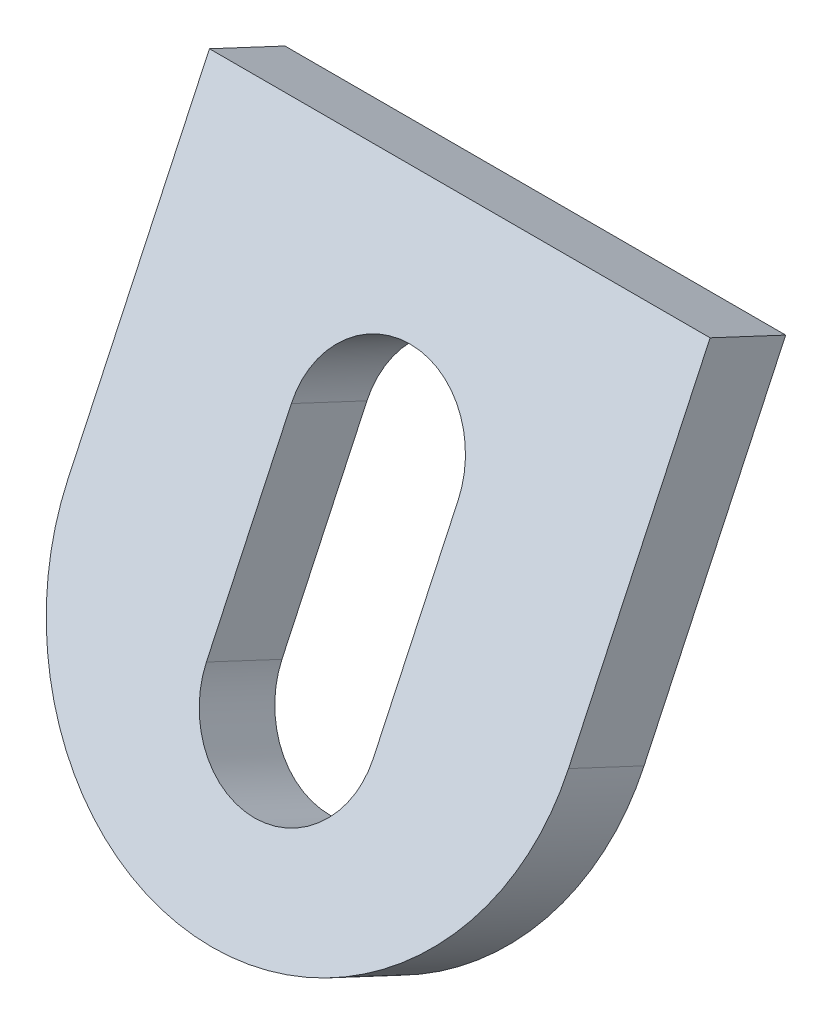
ISO-10303-21;
HEADER;
FILE_DESCRIPTION(('STEP AP214'),'2;1');
FILE_NAME('part.step','',(''),(''),'','','');
FILE_SCHEMA(('AUTOMOTIVE_DESIGN { 1 0 10303 214 1 1 1 1 }'));
ENDSEC;
DATA;
#1=APPLICATION_CONTEXT('core data for automotive mechanical design processes');
#2=APPLICATION_PROTOCOL_DEFINITION('international standard','automotive_design',2000,#1);
#3=PRODUCT_CONTEXT('',#1,'mechanical');
#4=PRODUCT('Part','Part','',(#3));
#5=PRODUCT_RELATED_PRODUCT_CATEGORY('part','',(#4));
#6=PRODUCT_DEFINITION_FORMATION('','',#4);
#7=PRODUCT_DEFINITION_CONTEXT('part definition',#1,'design');
#8=PRODUCT_DEFINITION('design','',#6,#7);
#9=PRODUCT_DEFINITION_SHAPE('','',#8);
#10=(LENGTH_UNIT() NAMED_UNIT(*) SI_UNIT(.MILLI.,.METRE.));
#11=(NAMED_UNIT(*) PLANE_ANGLE_UNIT() SI_UNIT($,.RADIAN.));
#12=(NAMED_UNIT(*) SI_UNIT($,.STERADIAN.) SOLID_ANGLE_UNIT());
#13=UNCERTAINTY_MEASURE_WITH_UNIT(LENGTH_MEASURE(1.E-05),#10,'distance_accuracy_value','');
#14=(GEOMETRIC_REPRESENTATION_CONTEXT(3) GLOBAL_UNCERTAINTY_ASSIGNED_CONTEXT((#13)) GLOBAL_UNIT_ASSIGNED_CONTEXT((#10,
#11,#12)) REPRESENTATION_CONTEXT('',''));
#15=CARTESIAN_POINT('',(0.,0.,0.));
#16=DIRECTION('',(0.,0.,1.));
#17=DIRECTION('',(1.,0.,0.));
#18=AXIS2_PLACEMENT_3D('',#15,#16,#17);
#19=CARTESIAN_POINT('',(-213.964586571095,410.146358388483,-126.048610694878));
#20=DIRECTION('',(0.,0.424263950718159,0.905538569096325));
#21=DIRECTION('',(0.,-0.905538569096325,0.424263950718159));
#22=AXIS2_PLACEMENT_3D('',#19,#20,#21);
#23=PLANE('',#22);
#24=DIRECTION('',(0.,-0.905538569096325,0.424263950718158));
#25=VECTOR('',#24,1.);
#26=CARTESIAN_POINT('',(-223.489586571095,421.646698216007,-131.436762868998));
#27=LINE('',#26,#25);
#28=CARTESIAN_POINT('',(-223.489586571095,421.646698216007,-131.436762868998));
#29=VERTEX_POINT('',#28);
#30=CARTESIAN_POINT('',(-223.489586571095,410.146358388483,-126.048610694878));
#31=VERTEX_POINT('',#30);
#32=EDGE_CURVE('E140',#29,#31,#27,.T.);
#33=ORIENTED_EDGE('',*,*,#32,.T.);
#34=CARTESIAN_POINT('',(-213.964586571095,410.146358388483,-126.048610694878));
#35=DIRECTION('',(0.,0.424263950718159,0.905538569096325));
#36=DIRECTION('',(0.,-0.905538569096325,0.424263950718159));
#37=AXIS2_PLACEMENT_3D('',#34,#35,#36);
#38=CIRCLE('',#37,9.52500000000003);
#39=CARTESIAN_POINT('',(-204.439586571095,410.146358388483,-126.048610694878));
#40=VERTEX_POINT('',#39);
#41=EDGE_CURVE('E143',#31,#40,#38,.T.);
#42=ORIENTED_EDGE('',*,*,#41,.T.);
#43=DIRECTION('',(0.,0.905538569096325,-0.424263950718158));
#44=VECTOR('',#43,1.);
#45=CARTESIAN_POINT('',(-204.439586571095,421.646698216007,-131.436762868998));
#46=LINE('',#45,#44);
#47=CARTESIAN_POINT('',(-204.439586571095,421.646698216007,-131.436762868998));
#48=VERTEX_POINT('',#47);
#49=EDGE_CURVE('E146',#40,#48,#46,.T.);
#50=ORIENTED_EDGE('',*,*,#49,.T.);
#51=DIRECTION('',(-1.,0.,0.));
#52=VECTOR('',#51,1.);
#53=CARTESIAN_POINT('',(-223.489586571095,421.646698216007,-131.436762868998));
#54=LINE('',#53,#52);
#55=EDGE_CURVE('E148',#48,#29,#54,.T.);
#56=ORIENTED_EDGE('',*,*,#55,.T.);
#57=EDGE_LOOP('',(#33,#42,#50,#56));
#58=FACE_BOUND('',#57,.T.);
#59=DIRECTION('',(0.,-0.905538569096325,0.424263950718158));
#60=VECTOR('',#59,1.);
#61=CARTESIAN_POINT('',(-217.139586571095,414.746494319493,-128.203871564526));
#62=LINE('',#61,#60);
#63=CARTESIAN_POINT('',(-217.139586571095,414.746494319493,-128.203871564526));
#64=VERTEX_POINT('',#63);
#65=CARTESIAN_POINT('',(-217.139586571095,407.846290422979,-124.970980260054));
#66=VERTEX_POINT('',#65);
#67=EDGE_CURVE('E112',#64,#66,#62,.T.);
#68=ORIENTED_EDGE('',*,*,#67,.F.);
#69=CARTESIAN_POINT('',(-213.964586571095,414.746494319493,-128.203871564526));
#70=DIRECTION('',(0.,0.424263950718159,0.905538569096325));
#71=DIRECTION('',(0.,-0.905538569096325,0.424263950718159));
#72=AXIS2_PLACEMENT_3D('',#69,#70,#71);
#73=CIRCLE('',#72,3.17500000000001);
#74=CARTESIAN_POINT('',(-210.789586571095,414.746494319493,-128.203871564526));
#75=VERTEX_POINT('',#74);
#76=EDGE_CURVE('E104',#75,#64,#73,.T.);
#77=ORIENTED_EDGE('',*,*,#76,.F.);
#78=DIRECTION('',(0.,0.905538569096325,-0.424263950718158));
#79=VECTOR('',#78,1.);
#80=CARTESIAN_POINT('',(-210.789586571095,407.846290422979,-124.970980260054));
#81=LINE('',#80,#79);
#82=CARTESIAN_POINT('',(-210.789586571095,407.846290422979,-124.970980260054));
#83=VERTEX_POINT('',#82);
#84=EDGE_CURVE('E126',#83,#75,#81,.T.);
#85=ORIENTED_EDGE('',*,*,#84,.F.);
#86=CARTESIAN_POINT('',(-213.964586571095,407.846290422979,-124.970980260054));
#87=DIRECTION('',(0.,0.424263950718159,0.905538569096325));
#88=DIRECTION('',(0.,-0.905538569096325,0.424263950718159));
#89=AXIS2_PLACEMENT_3D('',#86,#87,#88);
#90=CIRCLE('',#89,3.17500000000001);
#91=EDGE_CURVE('E124',#66,#83,#90,.T.);
#92=ORIENTED_EDGE('',*,*,#91,.F.);
#93=EDGE_LOOP('',(#68,#77,#85,#92));
#94=FACE_BOUND('',#93,.T.);
#95=ADVANCED_FACE('F39',(#58,#94),#23,.T.);
#96=CARTESIAN_POINT('',(-213.964586571095,408.799320344953,-128.923695651759));
#97=DIRECTION('',(0.,0.424263950718159,0.905538569096325));
#98=DIRECTION('',(0.,-0.905538569096325,0.424263950718159));
#99=AXIS2_PLACEMENT_3D('',#96,#97,#98);
#100=PLANE('',#99);
#101=DIRECTION('',(0.,-0.905538569096325,0.424263950718158));
#102=VECTOR('',#101,1.);
#103=CARTESIAN_POINT('',(-223.489586571095,420.299660172477,-134.311847825879));
#104=LINE('',#103,#102);
#105=CARTESIAN_POINT('',(-223.489586571095,420.299660172477,-134.311847825879));
#106=VERTEX_POINT('',#105);
#107=CARTESIAN_POINT('',(-223.489586571095,408.799320344953,-128.923695651759));
#108=VERTEX_POINT('',#107);
#109=EDGE_CURVE('E120',#106,#108,#104,.T.);
#110=ORIENTED_EDGE('',*,*,#109,.F.);
#111=DIRECTION('',(-1.,0.,0.));
#112=VECTOR('',#111,1.);
#113=CARTESIAN_POINT('',(-223.489586571095,420.299660172477,-134.311847825879));
#114=LINE('',#113,#112);
#115=CARTESIAN_POINT('',(-204.439586571095,420.299660172477,-134.311847825879));
#116=VERTEX_POINT('',#115);
#117=EDGE_CURVE('E144',#116,#106,#114,.T.);
#118=ORIENTED_EDGE('',*,*,#117,.F.);
#119=DIRECTION('',(0.,0.905538569096325,-0.424263950718158));
#120=VECTOR('',#119,1.);
#121=CARTESIAN_POINT('',(-204.439586571095,420.299660172477,-134.311847825879));
#122=LINE('',#121,#120);
#123=CARTESIAN_POINT('',(-204.439586571095,408.799320344953,-128.923695651759));
#124=VERTEX_POINT('',#123);
#125=EDGE_CURVE('E155',#124,#116,#122,.T.);
#126=ORIENTED_EDGE('',*,*,#125,.F.);
#127=CARTESIAN_POINT('',(-213.964586571095,408.799320344953,-128.923695651759));
#128=DIRECTION('',(0.,0.424263950718159,0.905538569096325));
#129=DIRECTION('',(0.,-0.905538569096325,0.424263950718159));
#130=AXIS2_PLACEMENT_3D('',#127,#128,#129);
#131=CIRCLE('',#130,9.52500000000003);
#132=EDGE_CURVE('E153',#108,#124,#131,.T.);
#133=ORIENTED_EDGE('',*,*,#132,.F.);
#134=EDGE_LOOP('',(#110,#118,#126,#133));
#135=FACE_BOUND('',#134,.T.);
#136=CARTESIAN_POINT('',(-213.964586571095,413.399456275963,-131.078956521407));
#137=DIRECTION('',(0.,0.424263950718159,0.905538569096325));
#138=DIRECTION('',(0.,-0.905538569096325,0.424263950718159));
#139=AXIS2_PLACEMENT_3D('',#136,#137,#138);
#140=CIRCLE('',#139,3.17500000000001);
#141=CARTESIAN_POINT('',(-210.789586571095,413.399456275963,-131.078956521407));
#142=VERTEX_POINT('',#141);
#143=CARTESIAN_POINT('',(-217.139586571095,413.399456275963,-131.078956521407));
#144=VERTEX_POINT('',#143);
#145=EDGE_CURVE('E62',#142,#144,#140,.T.);
#146=ORIENTED_EDGE('',*,*,#145,.T.);
#147=DIRECTION('',(0.,-0.905538569096325,0.424263950718158));
#148=VECTOR('',#147,1.);
#149=CARTESIAN_POINT('',(-217.139586571095,413.399456275963,-131.078956521407));
#150=LINE('',#149,#148);
#151=CARTESIAN_POINT('',(-217.139586571095,406.499252379449,-127.846065216935));
#152=VERTEX_POINT('',#151);
#153=EDGE_CURVE('E119',#144,#152,#150,.T.);
#154=ORIENTED_EDGE('',*,*,#153,.T.);
#155=CARTESIAN_POINT('',(-213.964586571095,406.499252379449,-127.846065216935));
#156=DIRECTION('',(0.,0.424263950718159,0.905538569096325));
#157=DIRECTION('',(0.,-0.905538569096325,0.424263950718159));
#158=AXIS2_PLACEMENT_3D('',#155,#156,#157);
#159=CIRCLE('',#158,3.17500000000001);
#160=CARTESIAN_POINT('',(-210.789586571095,406.499252379449,-127.846065216935));
#161=VERTEX_POINT('',#160);
#162=EDGE_CURVE('E132',#152,#161,#159,.T.);
#163=ORIENTED_EDGE('',*,*,#162,.T.);
#164=DIRECTION('',(0.,0.905538569096325,-0.424263950718158));
#165=VECTOR('',#164,1.);
#166=CARTESIAN_POINT('',(-210.789586571095,406.499252379449,-127.846065216935));
#167=LINE('',#166,#165);
#168=EDGE_CURVE('E113',#161,#142,#167,.T.);
#169=ORIENTED_EDGE('',*,*,#168,.T.);
#170=EDGE_LOOP('',(#146,#154,#163,#169));
#171=FACE_BOUND('',#170,.T.);
#172=ADVANCED_FACE('F173',(#135,#171),#100,.F.);
#173=CARTESIAN_POINT('',(-223.489586571095,421.646698216007,-131.436762868998));
#174=DIRECTION('',(1.,0.,0.));
#175=DIRECTION('',(0.,1.,0.));
#176=AXIS2_PLACEMENT_3D('',#173,#174,#175);
#177=PLANE('',#176);
#178=ORIENTED_EDGE('',*,*,#109,.T.);
#179=DIRECTION('',(0.,-0.424263950718159,-0.905538569096325));
#180=VECTOR('',#179,1.);
#181=CARTESIAN_POINT('',(-223.489586571095,410.146358388483,-126.048610694878));
#182=LINE('',#181,#180);
#183=EDGE_CURVE('E11',#31,#108,#182,.T.);
#184=ORIENTED_EDGE('',*,*,#183,.F.);
#185=ORIENTED_EDGE('',*,*,#32,.F.);
#186=DIRECTION('',(0.,-0.424263950718159,-0.905538569096325));
#187=VECTOR('',#186,1.);
#188=CARTESIAN_POINT('',(-223.489586571095,421.646698216007,-131.436762868998));
#189=LINE('',#188,#187);
#190=EDGE_CURVE('E150',#29,#106,#189,.T.);
#191=ORIENTED_EDGE('',*,*,#190,.T.);
#192=EDGE_LOOP('',(#178,#184,#185,#191));
#193=FACE_BOUND('',#192,.T.);
#194=ADVANCED_FACE('F41',(#193),#177,.F.);
#195=CARTESIAN_POINT('',(-213.964586571095,410.146358388483,-126.048610694878));
#196=DIRECTION('',(0.,-0.424263950718159,-0.905538569096325));
#197=DIRECTION('',(0.,0.905538569096325,-0.424263950718159));
#198=AXIS2_PLACEMENT_3D('',#195,#196,#197);
#199=CYLINDRICAL_SURFACE('',#198,9.52500000000003);
#200=ORIENTED_EDGE('',*,*,#132,.T.);
#201=DIRECTION('',(0.,-0.424263950718159,-0.905538569096325));
#202=VECTOR('',#201,1.);
#203=CARTESIAN_POINT('',(-204.439586571095,410.146358388483,-126.048610694878));
#204=LINE('',#203,#202);
#205=EDGE_CURVE('E47',#40,#124,#204,.T.);
#206=ORIENTED_EDGE('',*,*,#205,.F.);
#207=ORIENTED_EDGE('',*,*,#41,.F.);
#208=ORIENTED_EDGE('',*,*,#183,.T.);
#209=EDGE_LOOP('',(#200,#206,#207,#208));
#210=FACE_BOUND('',#209,.T.);
#211=ADVANCED_FACE('F183',(#210),#199,.T.);
#212=CARTESIAN_POINT('',(-204.439586571095,421.646698216007,-131.436762868998));
#213=DIRECTION('',(-1.,0.,0.));
#214=DIRECTION('',(0.,-1.,0.));
#215=AXIS2_PLACEMENT_3D('',#212,#213,#214);
#216=PLANE('',#215);
#217=ORIENTED_EDGE('',*,*,#125,.T.);
#218=DIRECTION('',(0.,-0.424263950718159,-0.905538569096325));
#219=VECTOR('',#218,1.);
#220=CARTESIAN_POINT('',(-204.439586571095,421.646698216007,-131.436762868998));
#221=LINE('',#220,#219);
#222=EDGE_CURVE('E160',#48,#116,#221,.T.);
#223=ORIENTED_EDGE('',*,*,#222,.F.);
#224=ORIENTED_EDGE('',*,*,#49,.F.);
#225=ORIENTED_EDGE('',*,*,#205,.T.);
#226=EDGE_LOOP('',(#217,#223,#224,#225));
#227=FACE_BOUND('',#226,.T.);
#228=ADVANCED_FACE('F167',(#227),#216,.F.);
#229=CARTESIAN_POINT('',(-223.489586571095,421.646698216007,-131.436762868998));
#230=DIRECTION('',(0.,-0.905538569096325,0.424263950718159));
#231=DIRECTION('',(0.,-0.424263950718159,-0.905538569096325));
#232=AXIS2_PLACEMENT_3D('',#229,#230,#231);
#233=PLANE('',#232);
#234=ORIENTED_EDGE('',*,*,#117,.T.);
#235=ORIENTED_EDGE('',*,*,#190,.F.);
#236=ORIENTED_EDGE('',*,*,#55,.F.);
#237=ORIENTED_EDGE('',*,*,#222,.T.);
#238=EDGE_LOOP('',(#234,#235,#236,#237));
#239=FACE_BOUND('',#238,.T.);
#240=ADVANCED_FACE('F177',(#239),#233,.F.);
#241=CARTESIAN_POINT('',(-213.964586571095,414.746494319493,-128.203871564526));
#242=DIRECTION('',(0.,-0.424263950718159,-0.905538569096325));
#243=DIRECTION('',(0.,0.905538569096325,-0.424263950718159));
#244=AXIS2_PLACEMENT_3D('',#241,#242,#243);
#245=CYLINDRICAL_SURFACE('',#244,3.17500000000001);
#246=ORIENTED_EDGE('',*,*,#145,.F.);
#247=DIRECTION('',(0.,-0.424263950718159,-0.905538569096325));
#248=VECTOR('',#247,1.);
#249=CARTESIAN_POINT('',(-210.789586571095,414.746494319493,-128.203871564526));
#250=LINE('',#249,#248);
#251=EDGE_CURVE('E108',#75,#142,#250,.T.);
#252=ORIENTED_EDGE('',*,*,#251,.F.);
#253=ORIENTED_EDGE('',*,*,#76,.T.);
#254=DIRECTION('',(0.,-0.424263950718159,-0.905538569096325));
#255=VECTOR('',#254,1.);
#256=CARTESIAN_POINT('',(-217.139586571095,414.746494319493,-128.203871564526));
#257=LINE('',#256,#255);
#258=EDGE_CURVE('E107',#64,#144,#257,.T.);
#259=ORIENTED_EDGE('',*,*,#258,.T.);
#260=EDGE_LOOP('',(#246,#252,#253,#259));
#261=FACE_BOUND('',#260,.T.);
#262=ADVANCED_FACE('F106',(#261),#245,.F.);
#263=CARTESIAN_POINT('',(-217.139586571095,414.746494319493,-128.203871564526));
#264=DIRECTION('',(1.,0.,0.));
#265=DIRECTION('',(0.,0.,-1.));
#266=AXIS2_PLACEMENT_3D('',#263,#264,#265);
#267=PLANE('',#266);
#268=ORIENTED_EDGE('',*,*,#153,.F.);
#269=ORIENTED_EDGE('',*,*,#258,.F.);
#270=ORIENTED_EDGE('',*,*,#67,.T.);
#271=DIRECTION('',(0.,-0.424263950718159,-0.905538569096325));
#272=VECTOR('',#271,1.);
#273=CARTESIAN_POINT('',(-217.139586571095,407.846290422979,-124.970980260054));
#274=LINE('',#273,#272);
#275=EDGE_CURVE('E121',#66,#152,#274,.T.);
#276=ORIENTED_EDGE('',*,*,#275,.T.);
#277=EDGE_LOOP('',(#268,#269,#270,#276));
#278=FACE_BOUND('',#277,.T.);
#279=ADVANCED_FACE('F116',(#278),#267,.T.);
#280=CARTESIAN_POINT('',(-213.964586571095,407.846290422979,-124.970980260054));
#281=DIRECTION('',(0.,-0.424263950718159,-0.905538569096325));
#282=DIRECTION('',(0.,0.905538569096325,-0.424263950718159));
#283=AXIS2_PLACEMENT_3D('',#280,#281,#282);
#284=CYLINDRICAL_SURFACE('',#283,3.17500000000001);
#285=ORIENTED_EDGE('',*,*,#162,.F.);
#286=ORIENTED_EDGE('',*,*,#275,.F.);
#287=ORIENTED_EDGE('',*,*,#91,.T.);
#288=DIRECTION('',(0.,-0.424263950718159,-0.905538569096325));
#289=VECTOR('',#288,1.);
#290=CARTESIAN_POINT('',(-210.789586571095,407.846290422979,-124.970980260054));
#291=LINE('',#290,#289);
#292=EDGE_CURVE('E54',#83,#161,#291,.T.);
#293=ORIENTED_EDGE('',*,*,#292,.T.);
#294=EDGE_LOOP('',(#285,#286,#287,#293));
#295=FACE_BOUND('',#294,.T.);
#296=ADVANCED_FACE('F206',(#295),#284,.F.);
#297=CARTESIAN_POINT('',(-210.789586571095,407.846290422979,-124.970980260054));
#298=DIRECTION('',(-1.,0.,0.));
#299=DIRECTION('',(0.,0.,1.));
#300=AXIS2_PLACEMENT_3D('',#297,#298,#299);
#301=PLANE('',#300);
#302=ORIENTED_EDGE('',*,*,#168,.F.);
#303=ORIENTED_EDGE('',*,*,#292,.F.);
#304=ORIENTED_EDGE('',*,*,#84,.T.);
#305=ORIENTED_EDGE('',*,*,#251,.T.);
#306=EDGE_LOOP('',(#302,#303,#304,#305));
#307=FACE_BOUND('',#306,.T.);
#308=ADVANCED_FACE('F210',(#307),#301,.T.);
#309=CLOSED_SHELL('',(#95,#172,#194,#211,#228,#240,#262,#279,#296,#308));
#310=MANIFOLD_SOLID_BREP('B2',#309);
#311=ADVANCED_BREP_SHAPE_REPRESENTATION('',(#18,#310),#14);
#312=SHAPE_DEFINITION_REPRESENTATION(#9,#311);
ENDSEC;
END-ISO-10303-21;
